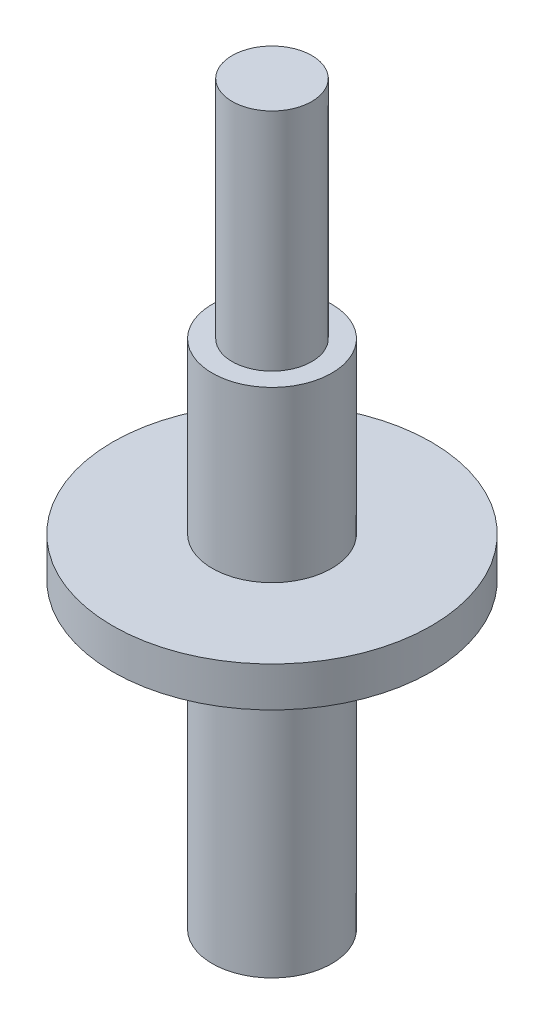
ISO-10303-21;
HEADER;
FILE_DESCRIPTION(('STEP AP214'),'2;1');
FILE_NAME('part.step','',(''),(''),'','','');
FILE_SCHEMA(('AUTOMOTIVE_DESIGN { 1 0 10303 214 1 1 1 1 }'));
ENDSEC;
DATA;
#1=APPLICATION_CONTEXT('core data for automotive mechanical design processes');
#2=APPLICATION_PROTOCOL_DEFINITION('international standard','automotive_design',2000,#1);
#3=PRODUCT_CONTEXT('',#1,'mechanical');
#4=PRODUCT('Part','Part','',(#3));
#5=PRODUCT_RELATED_PRODUCT_CATEGORY('part','',(#4));
#6=PRODUCT_DEFINITION_FORMATION('','',#4);
#7=PRODUCT_DEFINITION_CONTEXT('part definition',#1,'design');
#8=PRODUCT_DEFINITION('design','',#6,#7);
#9=PRODUCT_DEFINITION_SHAPE('','',#8);
#10=(LENGTH_UNIT() NAMED_UNIT(*) SI_UNIT(.MILLI.,.METRE.));
#11=(NAMED_UNIT(*) PLANE_ANGLE_UNIT() SI_UNIT($,.RADIAN.));
#12=(NAMED_UNIT(*) SI_UNIT($,.STERADIAN.) SOLID_ANGLE_UNIT());
#13=UNCERTAINTY_MEASURE_WITH_UNIT(LENGTH_MEASURE(1.E-05),#10,'distance_accuracy_value','');
#14=(GEOMETRIC_REPRESENTATION_CONTEXT(3) GLOBAL_UNCERTAINTY_ASSIGNED_CONTEXT((#13)) GLOBAL_UNIT_ASSIGNED_CONTEXT((#10,
#11,#12)) REPRESENTATION_CONTEXT('',''));
#15=CARTESIAN_POINT('',(0.,0.,0.));
#16=DIRECTION('',(0.,0.,1.));
#17=DIRECTION('',(1.,0.,0.));
#18=AXIS2_PLACEMENT_3D('',#15,#16,#17);
#19=CARTESIAN_POINT('',(3.,0.,0.));
#20=DIRECTION('',(0.,-1.,0.));
#21=DIRECTION('',(0.,0.,-1.));
#22=AXIS2_PLACEMENT_3D('',#19,#20,#21);
#23=PLANE('',#22);
#24=CARTESIAN_POINT('',(0.,0.,0.));
#25=DIRECTION('',(0.,-1.,0.));
#26=DIRECTION('',(0.,0.,-1.));
#27=AXIS2_PLACEMENT_3D('',#24,#25,#26);
#28=CIRCLE('',#27,2.);
#29=CARTESIAN_POINT('',(0.,0.,-2.));
#30=VERTEX_POINT('',#29);
#31=EDGE_CURVE('E62',#30,#30,#28,.T.);
#32=ORIENTED_EDGE('',*,*,#31,.F.);
#33=EDGE_LOOP('',(#32));
#34=FACE_BOUND('',#33,.T.);
#35=CARTESIAN_POINT('',(0.,0.,0.));
#36=DIRECTION('',(0.,-1.,0.));
#37=DIRECTION('',(0.,0.,-1.));
#38=AXIS2_PLACEMENT_3D('',#35,#36,#37);
#39=CIRCLE('',#38,3.);
#40=CARTESIAN_POINT('',(0.,0.,-3.));
#41=VERTEX_POINT('',#40);
#42=EDGE_CURVE('E58',#41,#41,#39,.T.);
#43=ORIENTED_EDGE('',*,*,#42,.T.);
#44=EDGE_LOOP('',(#43));
#45=FACE_BOUND('',#44,.T.);
#46=ADVANCED_FACE('F30',(#34,#45),#23,.T.);
#47=CARTESIAN_POINT('',(0.,37.,0.));
#48=DIRECTION('',(0.,1.,0.));
#49=DIRECTION('',(0.,0.,1.));
#50=AXIS2_PLACEMENT_3D('',#47,#48,#49);
#51=PLANE('',#50);
#52=CARTESIAN_POINT('',(0.,37.,0.));
#53=DIRECTION('',(0.,-1.,0.));
#54=DIRECTION('',(0.,0.,-1.));
#55=AXIS2_PLACEMENT_3D('',#52,#53,#54);
#56=CIRCLE('',#55,2.);
#57=CARTESIAN_POINT('',(0.,37.,-2.));
#58=VERTEX_POINT('',#57);
#59=EDGE_CURVE('E10',#58,#58,#56,.T.);
#60=ORIENTED_EDGE('',*,*,#59,.F.);
#61=EDGE_LOOP('',(#60));
#62=FACE_BOUND('',#61,.T.);
#63=ADVANCED_FACE('F79',(#62),#51,.T.);
#64=CARTESIAN_POINT('',(0.,0.,0.));
#65=DIRECTION('',(0.,-1.,0.));
#66=DIRECTION('',(0.,0.,-1.));
#67=AXIS2_PLACEMENT_3D('',#64,#65,#66);
#68=CYLINDRICAL_SURFACE('',#67,2.);
#69=ORIENTED_EDGE('',*,*,#59,.T.);
#70=EDGE_LOOP('',(#69));
#71=FACE_BOUND('',#70,.T.);
#72=CARTESIAN_POINT('',(0.,25.6845183864858,0.));
#73=DIRECTION('',(0.,-1.,0.));
#74=DIRECTION('',(0.,0.,-1.));
#75=AXIS2_PLACEMENT_3D('',#72,#73,#74);
#76=CIRCLE('',#75,2.);
#77=CARTESIAN_POINT('',(0.,25.6845183864858,-2.));
#78=VERTEX_POINT('',#77);
#79=EDGE_CURVE('E36',#78,#78,#76,.T.);
#80=ORIENTED_EDGE('',*,*,#79,.F.);
#81=EDGE_LOOP('',(#80));
#82=FACE_BOUND('',#81,.T.);
#83=ADVANCED_FACE('F108',(#71,#82),#68,.T.);
#84=CARTESIAN_POINT('',(3.,25.6845183864858,0.));
#85=DIRECTION('',(0.,1.,0.));
#86=DIRECTION('',(0.,0.,1.));
#87=AXIS2_PLACEMENT_3D('',#84,#85,#86);
#88=PLANE('',#87);
#89=ORIENTED_EDGE('',*,*,#79,.T.);
#90=EDGE_LOOP('',(#89));
#91=FACE_BOUND('',#90,.T.);
#92=CARTESIAN_POINT('',(0.,25.6845183864858,0.));
#93=DIRECTION('',(0.,-1.,0.));
#94=DIRECTION('',(0.,0.,-1.));
#95=AXIS2_PLACEMENT_3D('',#92,#93,#94);
#96=CIRCLE('',#95,3.);
#97=CARTESIAN_POINT('',(0.,25.6845183864858,-3.));
#98=VERTEX_POINT('',#97);
#99=EDGE_CURVE('E40',#98,#98,#96,.T.);
#100=ORIENTED_EDGE('',*,*,#99,.F.);
#101=EDGE_LOOP('',(#100));
#102=FACE_BOUND('',#101,.T.);
#103=ADVANCED_FACE('F104',(#91,#102),#88,.T.);
#104=CARTESIAN_POINT('',(0.,0.,0.));
#105=DIRECTION('',(0.,-1.,0.));
#106=DIRECTION('',(0.,0.,-1.));
#107=AXIS2_PLACEMENT_3D('',#104,#105,#106);
#108=CYLINDRICAL_SURFACE('',#107,3.);
#109=ORIENTED_EDGE('',*,*,#99,.T.);
#110=EDGE_LOOP('',(#109));
#111=FACE_BOUND('',#110,.T.);
#112=CARTESIAN_POINT('',(0.,17.191909634288,0.));
#113=DIRECTION('',(0.,-1.,0.));
#114=DIRECTION('',(0.,0.,-1.));
#115=AXIS2_PLACEMENT_3D('',#112,#113,#114);
#116=CIRCLE('',#115,3.);
#117=CARTESIAN_POINT('',(0.,17.191909634288,-3.));
#118=VERTEX_POINT('',#117);
#119=EDGE_CURVE('E44',#118,#118,#116,.T.);
#120=ORIENTED_EDGE('',*,*,#119,.F.);
#121=EDGE_LOOP('',(#120));
#122=FACE_BOUND('',#121,.T.);
#123=ADVANCED_FACE('F100',(#111,#122),#108,.T.);
#124=CARTESIAN_POINT('',(3.,17.191909634288,0.));
#125=DIRECTION('',(0.,1.,0.));
#126=DIRECTION('',(0.,0.,1.));
#127=AXIS2_PLACEMENT_3D('',#124,#125,#126);
#128=PLANE('',#127);
#129=ORIENTED_EDGE('',*,*,#119,.T.);
#130=EDGE_LOOP('',(#129));
#131=FACE_BOUND('',#130,.T.);
#132=CARTESIAN_POINT('',(0.,17.191909634288,0.));
#133=DIRECTION('',(0.,-1.,0.));
#134=DIRECTION('',(0.,0.,-1.));
#135=AXIS2_PLACEMENT_3D('',#132,#133,#134);
#136=CIRCLE('',#135,8.);
#137=CARTESIAN_POINT('',(0.,17.191909634288,-8.));
#138=VERTEX_POINT('',#137);
#139=EDGE_CURVE('E49',#138,#138,#136,.T.);
#140=ORIENTED_EDGE('',*,*,#139,.F.);
#141=EDGE_LOOP('',(#140));
#142=FACE_BOUND('',#141,.T.);
#143=ADVANCED_FACE('F96',(#131,#142),#128,.T.);
#144=CARTESIAN_POINT('',(0.,0.,0.));
#145=DIRECTION('',(0.,-1.,0.));
#146=DIRECTION('',(0.,0.,-1.));
#147=AXIS2_PLACEMENT_3D('',#144,#145,#146);
#148=CYLINDRICAL_SURFACE('',#147,8.);
#149=ORIENTED_EDGE('',*,*,#139,.T.);
#150=EDGE_LOOP('',(#149));
#151=FACE_BOUND('',#150,.T.);
#152=CARTESIAN_POINT('',(0.,15.191909634288,0.));
#153=DIRECTION('',(0.,-1.,0.));
#154=DIRECTION('',(0.,0.,-1.));
#155=AXIS2_PLACEMENT_3D('',#152,#153,#154);
#156=CIRCLE('',#155,8.);
#157=CARTESIAN_POINT('',(0.,15.191909634288,-8.));
#158=VERTEX_POINT('',#157);
#159=EDGE_CURVE('E52',#158,#158,#156,.T.);
#160=ORIENTED_EDGE('',*,*,#159,.F.);
#161=EDGE_LOOP('',(#160));
#162=FACE_BOUND('',#161,.T.);
#163=ADVANCED_FACE('F89',(#151,#162),#148,.T.);
#164=CARTESIAN_POINT('',(8.,15.191909634288,0.));
#165=DIRECTION('',(0.,-1.,0.));
#166=DIRECTION('',(0.,0.,-1.));
#167=AXIS2_PLACEMENT_3D('',#164,#165,#166);
#168=PLANE('',#167);
#169=ORIENTED_EDGE('',*,*,#159,.T.);
#170=EDGE_LOOP('',(#169));
#171=FACE_BOUND('',#170,.T.);
#172=CARTESIAN_POINT('',(0.,15.191909634288,0.));
#173=DIRECTION('',(0.,-1.,0.));
#174=DIRECTION('',(0.,0.,-1.));
#175=AXIS2_PLACEMENT_3D('',#172,#173,#174);
#176=CIRCLE('',#175,3.);
#177=CARTESIAN_POINT('',(0.,15.191909634288,-3.));
#178=VERTEX_POINT('',#177);
#179=EDGE_CURVE('E55',#178,#178,#176,.T.);
#180=ORIENTED_EDGE('',*,*,#179,.F.);
#181=EDGE_LOOP('',(#180));
#182=FACE_BOUND('',#181,.T.);
#183=ADVANCED_FACE('F83',(#171,#182),#168,.T.);
#184=CARTESIAN_POINT('',(0.,0.,0.));
#185=DIRECTION('',(0.,-1.,0.));
#186=DIRECTION('',(0.,0.,-1.));
#187=AXIS2_PLACEMENT_3D('',#184,#185,#186);
#188=CYLINDRICAL_SURFACE('',#187,3.);
#189=ORIENTED_EDGE('',*,*,#179,.T.);
#190=EDGE_LOOP('',(#189));
#191=FACE_BOUND('',#190,.T.);
#192=ORIENTED_EDGE('',*,*,#42,.F.);
#193=EDGE_LOOP('',(#192));
#194=FACE_BOUND('',#193,.T.);
#195=ADVANCED_FACE('F73',(#191,#194),#188,.T.);
#196=CARTESIAN_POINT('',(0.,6.,0.));
#197=DIRECTION('',(0.,-1.,0.));
#198=DIRECTION('',(0.,0.,-1.));
#199=AXIS2_PLACEMENT_3D('',#196,#197,#198);
#200=CYLINDRICAL_SURFACE('',#199,2.);
#201=CARTESIAN_POINT('',(0.,6.,0.));
#202=DIRECTION('',(0.,-1.,0.));
#203=DIRECTION('',(0.,0.,-1.));
#204=AXIS2_PLACEMENT_3D('',#201,#202,#203);
#205=CIRCLE('',#204,2.);
#206=CARTESIAN_POINT('',(0.,6.,-2.));
#207=VERTEX_POINT('',#206);
#208=EDGE_CURVE('E61',#207,#207,#205,.T.);
#209=ORIENTED_EDGE('',*,*,#208,.F.);
#210=EDGE_LOOP('',(#209));
#211=FACE_BOUND('',#210,.T.);
#212=ORIENTED_EDGE('',*,*,#31,.T.);
#213=EDGE_LOOP('',(#212));
#214=FACE_BOUND('',#213,.T.);
#215=ADVANCED_FACE('F70',(#211,#214),#200,.F.);
#216=CARTESIAN_POINT('',(0.,6.,0.));
#217=DIRECTION('',(0.,-1.,0.));
#218=DIRECTION('',(0.,0.,-1.));
#219=AXIS2_PLACEMENT_3D('',#216,#217,#218);
#220=PLANE('',#219);
#221=ORIENTED_EDGE('',*,*,#208,.T.);
#222=EDGE_LOOP('',(#221));
#223=FACE_BOUND('',#222,.T.);
#224=ADVANCED_FACE('F68',(#223),#220,.T.);
#225=CLOSED_SHELL('',(#46,#63,#83,#103,#123,#143,#163,#183,#195,#215,#224));
#226=MANIFOLD_SOLID_BREP('B2',#225);
#227=ADVANCED_BREP_SHAPE_REPRESENTATION('',(#18,#226),#14);
#228=SHAPE_DEFINITION_REPRESENTATION(#9,#227);
ENDSEC;
END-ISO-10303-21;
